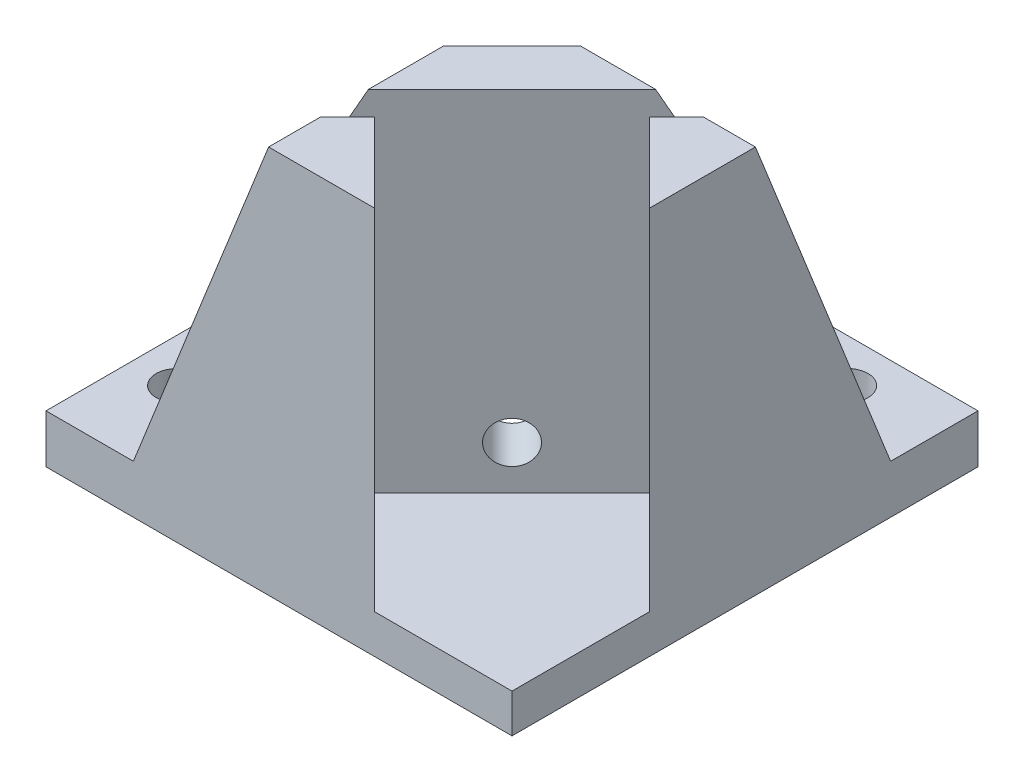
ISO-10303-21;
HEADER;
FILE_DESCRIPTION(('STEP AP214'),'2;1');
FILE_NAME('part.step','',(''),(''),'','','');
FILE_SCHEMA(('AUTOMOTIVE_DESIGN { 1 0 10303 214 1 1 1 1 }'));
ENDSEC;
DATA;
#1=APPLICATION_CONTEXT('core data for automotive mechanical design processes');
#2=APPLICATION_PROTOCOL_DEFINITION('international standard','automotive_design',2000,#1);
#3=PRODUCT_CONTEXT('',#1,'mechanical');
#4=PRODUCT('Part','Part','',(#3));
#5=PRODUCT_RELATED_PRODUCT_CATEGORY('part','',(#4));
#6=PRODUCT_DEFINITION_FORMATION('','',#4);
#7=PRODUCT_DEFINITION_CONTEXT('part definition',#1,'design');
#8=PRODUCT_DEFINITION('design','',#6,#7);
#9=PRODUCT_DEFINITION_SHAPE('','',#8);
#10=(LENGTH_UNIT() NAMED_UNIT(*) SI_UNIT(.MILLI.,.METRE.));
#11=(NAMED_UNIT(*) PLANE_ANGLE_UNIT() SI_UNIT($,.RADIAN.));
#12=(NAMED_UNIT(*) SI_UNIT($,.STERADIAN.) SOLID_ANGLE_UNIT());
#13=UNCERTAINTY_MEASURE_WITH_UNIT(LENGTH_MEASURE(1.E-05),#10,'distance_accuracy_value','');
#14=(GEOMETRIC_REPRESENTATION_CONTEXT(3) GLOBAL_UNCERTAINTY_ASSIGNED_CONTEXT((#13)) GLOBAL_UNIT_ASSIGNED_CONTEXT((#10,
#11,#12)) REPRESENTATION_CONTEXT('',''));
#15=CARTESIAN_POINT('',(0.,0.,0.));
#16=DIRECTION('',(0.,0.,1.));
#17=DIRECTION('',(1.,0.,0.));
#18=AXIS2_PLACEMENT_3D('',#15,#16,#17);
#19=CARTESIAN_POINT('',(0.,40.,0.));
#20=DIRECTION('',(0.,1.,0.));
#21=DIRECTION('',(0.,0.,1.));
#22=AXIS2_PLACEMENT_3D('',#19,#20,#21);
#23=PLANE('',#22);
#24=DIRECTION('',(1.,0.,0.));
#25=VECTOR('',#24,1.);
#26=CARTESIAN_POINT('',(0.,40.,-25.0709011047266));
#27=LINE('',#26,#25);
#28=CARTESIAN_POINT('',(30.,40.,-25.0709011047266));
#29=VERTEX_POINT('',#28);
#30=CARTESIAN_POINT('',(37.7155620453992,40.,-25.0709011047266));
#31=VERTEX_POINT('',#30);
#32=EDGE_CURVE('E11',#29,#31,#27,.T.);
#33=ORIENTED_EDGE('',*,*,#32,.F.);
#34=DIRECTION('',(-0.707106781186549,0.,0.707106781186546));
#35=VECTOR('',#34,1.);
#36=CARTESIAN_POINT('',(30.,40.,-25.0709011047266));
#37=LINE('',#36,#35);
#38=CARTESIAN_POINT('',(22.9290988952734,40.,-18.));
#39=VERTEX_POINT('',#38);
#40=EDGE_CURVE('E311',#29,#39,#37,.T.);
#41=ORIENTED_EDGE('',*,*,#40,.T.);
#42=DIRECTION('',(0.,0.,-1.));
#43=VECTOR('',#42,1.);
#44=CARTESIAN_POINT('',(22.9290988952734,40.,12.));
#45=LINE('',#44,#43);
#46=CARTESIAN_POINT('',(22.9290988952734,40.,-10.2844379546007));
#47=VERTEX_POINT('',#46);
#48=EDGE_CURVE('E292',#47,#39,#45,.T.);
#49=ORIENTED_EDGE('',*,*,#48,.F.);
#50=DIRECTION('',(-0.707106781186547,0.,0.707106781186549));
#51=VECTOR('',#50,1.);
#52=CARTESIAN_POINT('',(23.2512626584708,40.,-10.6066017177981));
#53=LINE('',#52,#51);
#54=EDGE_CURVE('E358',#31,#47,#53,.T.);
#55=ORIENTED_EDGE('',*,*,#54,.F.);
#56=EDGE_LOOP('',(#33,#41,#49,#55));
#57=FACE_BOUND('',#56,.T.);
#58=ADVANCED_FACE('F39',(#57),#23,.T.);
#59=CARTESIAN_POINT('',(22.9290988952734,40.,0.));
#60=VERTEX_POINT('',#59);
#61=CARTESIAN_POINT('',(22.9290988952734,40.,-5.33469048629493));
#62=VERTEX_POINT('',#61);
#63=EDGE_CURVE('E295',#60,#62,#45,.T.);
#64=ORIENTED_EDGE('',*,*,#63,.F.);
#65=DIRECTION('',(1.,0.,0.));
#66=VECTOR('',#65,1.);
#67=CARTESIAN_POINT('',(0.,40.,0.));
#68=LINE('',#67,#66);
#69=CARTESIAN_POINT('',(33.857864376269,40.,0.));
#70=VERTEX_POINT('',#69);
#71=EDGE_CURVE('E254',#60,#70,#68,.T.);
#72=ORIENTED_EDGE('',*,*,#71,.T.);
#73=DIRECTION('',(0.707106781186546,0.,0.707106781186549));
#74=VECTOR('',#73,1.);
#75=CARTESIAN_POINT('',(33.857864376269,40.,0.));
#76=LINE('',#75,#74);
#77=CARTESIAN_POINT('',(25.7261363926238,40.,-8.13172798364525));
#78=VERTEX_POINT('',#77);
#79=EDGE_CURVE('E351',#78,#70,#76,.T.);
#80=ORIENTED_EDGE('',*,*,#79,.F.);
#81=DIRECTION('',(0.707106781186549,0.,-0.707106781186546));
#82=VECTOR('',#81,1.);
#83=CARTESIAN_POINT('',(17.9479617995718,40.,-0.353553390593284));
#84=LINE('',#83,#82);
#85=EDGE_CURVE('E360',#62,#78,#84,.T.);
#86=ORIENTED_EDGE('',*,*,#85,.F.);
#87=EDGE_LOOP('',(#64,#72,#80,#86));
#88=FACE_BOUND('',#87,.T.);
#89=ADVANCED_FACE('F423',(#88),#23,.T.);
#90=CARTESIAN_POINT('',(30.,40.,-48.));
#91=DIRECTION('',(1.,0.,0.));
#92=DIRECTION('',(0.,0.,-1.));
#93=AXIS2_PLACEMENT_3D('',#90,#91,#92);
#94=PLANE('',#93);
#95=DIRECTION('',(0.,-1.,0.));
#96=VECTOR('',#95,1.);
#97=CARTESIAN_POINT('',(30.,40.,-25.0709011047266));
#98=LINE('',#97,#96);
#99=CARTESIAN_POINT('',(30.,0.,-25.0709011047266));
#100=VERTEX_POINT('',#99);
#101=EDGE_CURVE('E316',#29,#100,#98,.T.);
#102=ORIENTED_EDGE('',*,*,#101,.F.);
#103=DIRECTION('',(0.,0.929124297161704,0.369767549176195));
#104=VECTOR('',#103,1.);
#105=CARTESIAN_POINT('',(30.,40.,-25.0709011047266));
#106=LINE('',#105,#104);
#107=CARTESIAN_POINT('',(30.,5.,-39.));
#108=VERTEX_POINT('',#107);
#109=EDGE_CURVE('E199',#108,#29,#106,.T.);
#110=ORIENTED_EDGE('',*,*,#109,.F.);
#111=DIRECTION('',(0.,0.,1.));
#112=VECTOR('',#111,1.);
#113=CARTESIAN_POINT('',(30.,5.,-39.));
#114=LINE('',#113,#112);
#115=CARTESIAN_POINT('',(30.,5.,-48.));
#116=VERTEX_POINT('',#115);
#117=EDGE_CURVE('E191',#116,#108,#114,.T.);
#118=ORIENTED_EDGE('',*,*,#117,.F.);
#119=DIRECTION('',(0.,-1.,0.));
#120=VECTOR('',#119,1.);
#121=CARTESIAN_POINT('',(30.,40.,-48.));
#122=LINE('',#121,#120);
#123=CARTESIAN_POINT('',(30.,0.,-48.));
#124=VERTEX_POINT('',#123);
#125=EDGE_CURVE('E204',#116,#124,#122,.T.);
#126=ORIENTED_EDGE('',*,*,#125,.T.);
#127=DIRECTION('',(0.,0.,1.));
#128=VECTOR('',#127,1.);
#129=CARTESIAN_POINT('',(30.,0.,-48.));
#130=LINE('',#129,#128);
#131=EDGE_CURVE('E271',#124,#100,#130,.T.);
#132=ORIENTED_EDGE('',*,*,#131,.T.);
#133=EDGE_LOOP('',(#102,#110,#118,#126,#132));
#134=FACE_BOUND('',#133,.T.);
#135=ADVANCED_FACE('F203',(#134),#94,.F.);
#136=CARTESIAN_POINT('',(30.,40.,-18.));
#137=DIRECTION('',(0.,0.,1.));
#138=DIRECTION('',(1.,0.,0.));
#139=AXIS2_PLACEMENT_3D('',#136,#137,#138);
#140=PLANE('',#139);
#141=DIRECTION('',(0.,-1.,0.));
#142=VECTOR('',#141,1.);
#143=CARTESIAN_POINT('',(0.,40.,-18.));
#144=LINE('',#143,#142);
#145=CARTESIAN_POINT('',(0.,5.,-18.));
#146=VERTEX_POINT('',#145);
#147=CARTESIAN_POINT('',(0.,0.,-18.));
#148=VERTEX_POINT('',#147);
#149=EDGE_CURVE('E213',#146,#148,#144,.T.);
#150=ORIENTED_EDGE('',*,*,#149,.F.);
#151=DIRECTION('',(-1.,0.,0.));
#152=VECTOR('',#151,1.);
#153=CARTESIAN_POINT('',(9.,5.,-18.));
#154=LINE('',#153,#152);
#155=CARTESIAN_POINT('',(9.,5.,-18.));
#156=VERTEX_POINT('',#155);
#157=EDGE_CURVE('E298',#156,#146,#154,.T.);
#158=ORIENTED_EDGE('',*,*,#157,.F.);
#159=DIRECTION('',(-0.369767549176194,-0.929124297161704,0.));
#160=VECTOR('',#159,1.);
#161=CARTESIAN_POINT('',(22.9290988952734,40.,-18.));
#162=LINE('',#161,#160);
#163=EDGE_CURVE('E293',#39,#156,#162,.T.);
#164=ORIENTED_EDGE('',*,*,#163,.F.);
#165=DIRECTION('',(0.,-1.,0.));
#166=VECTOR('',#165,1.);
#167=CARTESIAN_POINT('',(22.9290988952734,40.,-18.));
#168=LINE('',#167,#166);
#169=CARTESIAN_POINT('',(22.9290988952734,0.,-18.));
#170=VERTEX_POINT('',#169);
#171=EDGE_CURVE('E281',#39,#170,#168,.T.);
#172=ORIENTED_EDGE('',*,*,#171,.T.);
#173=DIRECTION('',(-1.,0.,0.));
#174=VECTOR('',#173,1.);
#175=CARTESIAN_POINT('',(30.,0.,-18.));
#176=LINE('',#175,#174);
#177=EDGE_CURVE('E256',#170,#148,#176,.T.);
#178=ORIENTED_EDGE('',*,*,#177,.T.);
#179=EDGE_LOOP('',(#150,#158,#164,#172,#178));
#180=FACE_BOUND('',#179,.T.);
#181=ADVANCED_FACE('F277',(#180),#140,.F.);
#182=CARTESIAN_POINT('',(0.,4.,0.));
#183=DIRECTION('',(0.,1.,0.));
#184=DIRECTION('',(0.,0.,1.));
#185=AXIS2_PLACEMENT_3D('',#182,#183,#184);
#186=PLANE('',#185);
#187=DIRECTION('',(-0.707106781186558,0.,-0.707106781186537));
#188=VECTOR('',#187,1.);
#189=CARTESIAN_POINT('',(48.,4.,-14.1421356237309));
#190=LINE('',#189,#188);
#191=CARTESIAN_POINT('',(48.,4.,-14.1421356237309));
#192=VERTEX_POINT('',#191);
#193=CARTESIAN_POINT('',(37.3933982822019,4.,-24.7487373415292));
#194=VERTEX_POINT('',#193);
#195=EDGE_CURVE('E350',#192,#194,#190,.T.);
#196=ORIENTED_EDGE('',*,*,#195,.T.);
#197=DIRECTION('',(-0.70710678118655,0.,0.707106781186545));
#198=VECTOR('',#197,1.);
#199=CARTESIAN_POINT('',(37.3933982822018,4.,-24.7487373415291));
#200=LINE('',#199,#198);
#201=CARTESIAN_POINT('',(23.2512626584709,4.,-10.6066017177981));
#202=VERTEX_POINT('',#201);
#203=EDGE_CURVE('E353',#194,#202,#200,.T.);
#204=ORIENTED_EDGE('',*,*,#203,.T.);
#205=DIRECTION('',(0.707106781186558,0.,0.707106781186537));
#206=VECTOR('',#205,1.);
#207=CARTESIAN_POINT('',(33.857864376269,4.,0.));
#208=LINE('',#207,#206);
#209=CARTESIAN_POINT('',(33.857864376269,4.,0.));
#210=VERTEX_POINT('',#209);
#211=EDGE_CURVE('E347',#202,#210,#208,.T.);
#212=ORIENTED_EDGE('',*,*,#211,.T.);
#213=DIRECTION('',(1.,0.,0.));
#214=VECTOR('',#213,1.);
#215=CARTESIAN_POINT('',(0.,4.,0.));
#216=LINE('',#215,#214);
#217=CARTESIAN_POINT('',(48.,4.,0.));
#218=VERTEX_POINT('',#217);
#219=EDGE_CURVE('E264',#210,#218,#216,.T.);
#220=ORIENTED_EDGE('',*,*,#219,.T.);
#221=DIRECTION('',(0.,0.,-1.));
#222=VECTOR('',#221,1.);
#223=CARTESIAN_POINT('',(48.,4.,0.));
#224=LINE('',#223,#222);
#225=EDGE_CURVE('E227',#218,#192,#224,.T.);
#226=ORIENTED_EDGE('',*,*,#225,.T.);
#227=EDGE_LOOP('',(#196,#204,#212,#220,#226));
#228=FACE_BOUND('',#227,.T.);
#229=ADVANCED_FACE('F387',(#228),#186,.T.);
#230=CARTESIAN_POINT('',(23.2512626584708,4.,-10.6066017177981));
#231=DIRECTION('',(-0.707106781186548,0.,-0.707106781186547));
#232=DIRECTION('',(-0.707106781186547,0.,0.707106781186548));
#233=AXIS2_PLACEMENT_3D('',#230,#231,#232);
#234=PLANE('',#233);
#235=CARTESIAN_POINT('',(30.3223304703364,8.5,-17.6776695296636));
#236=DIRECTION('',(0.707106781186548,0.,0.707106781186547));
#237=DIRECTION('',(0.707106781186547,0.,-0.707106781186548));
#238=AXIS2_PLACEMENT_3D('',#235,#236,#237);
#239=CIRCLE('',#238,2.15);
#240=CARTESIAN_POINT('',(31.8426100498874,8.5,-19.1979491092147));
#241=VERTEX_POINT('',#240);
#242=EDGE_CURVE('E234',#241,#241,#239,.T.);
#243=ORIENTED_EDGE('',*,*,#242,.F.);
#244=EDGE_LOOP('',(#243));
#245=FACE_BOUND('',#244,.T.);
#246=DIRECTION('',(0.,1.,0.));
#247=VECTOR('',#246,1.);
#248=CARTESIAN_POINT('',(45.1715728752539,4.,-32.5269119345811));
#249=LINE('',#248,#247);
#250=CARTESIAN_POINT('',(45.1715728752539,12.5,-32.5269119345811));
#251=VERTEX_POINT('',#250);
#252=CARTESIAN_POINT('',(45.1715728752539,21.2650925227144,-32.5269119345811));
#253=VERTEX_POINT('',#252);
#254=EDGE_CURVE('E374',#251,#253,#249,.T.);
#255=ORIENTED_EDGE('',*,*,#254,.T.);
#256=DIRECTION('',(-0.346817104595912,0.871456133101039,0.346817104595913));
#257=VECTOR('',#256,1.);
#258=CARTESIAN_POINT('',(45.1164614610626,21.4035723706351,-32.4718005203899));
#259=LINE('',#258,#257);
#260=EDGE_CURVE('E399',#253,#31,#259,.T.);
#261=ORIENTED_EDGE('',*,*,#260,.T.);
#262=ORIENTED_EDGE('',*,*,#54,.T.);
#263=DIRECTION('',(-0.346817104595912,-0.871456133101039,0.346817104595913));
#264=VECTOR('',#263,1.);
#265=CARTESIAN_POINT('',(12.126107822719,12.8550503961381,0.518553117953728));
#266=LINE('',#265,#264);
#267=CARTESIAN_POINT('',(15.4730880654188,21.2650925227143,-2.82842712474613));
#268=VERTEX_POINT('',#267);
#269=EDGE_CURVE('E303',#47,#268,#266,.T.);
#270=ORIENTED_EDGE('',*,*,#269,.T.);
#271=DIRECTION('',(0.,1.,0.));
#272=VECTOR('',#271,1.);
#273=CARTESIAN_POINT('',(15.4730880654188,4.,-2.82842712474613));
#274=LINE('',#273,#272);
#275=CARTESIAN_POINT('',(15.4730880654188,12.5,-2.82842712474613));
#276=VERTEX_POINT('',#275);
#277=EDGE_CURVE('E371',#276,#268,#274,.T.);
#278=ORIENTED_EDGE('',*,*,#277,.F.);
#279=DIRECTION('',(-0.707106781186551,0.,0.707106781186544));
#280=VECTOR('',#279,1.);
#281=CARTESIAN_POINT('',(23.2512626584709,12.5,-10.6066017177981));
#282=LINE('',#281,#280);
#283=CARTESIAN_POINT('',(23.2512626584708,12.5,-10.6066017177981));
#284=VERTEX_POINT('',#283);
#285=EDGE_CURVE('E324',#284,#276,#282,.T.);
#286=ORIENTED_EDGE('',*,*,#285,.F.);
#287=DIRECTION('',(0.,-1.,0.));
#288=VECTOR('',#287,1.);
#289=CARTESIAN_POINT('',(23.2512626584709,12.5,-10.6066017177981));
#290=LINE('',#289,#288);
#291=EDGE_CURVE('E319',#284,#202,#290,.T.);
#292=ORIENTED_EDGE('',*,*,#291,.T.);
#293=ORIENTED_EDGE('',*,*,#203,.F.);
#294=DIRECTION('',(0.,-1.,0.));
#295=VECTOR('',#294,1.);
#296=CARTESIAN_POINT('',(37.3933982822019,12.5,-24.7487373415291));
#297=LINE('',#296,#295);
#298=CARTESIAN_POINT('',(37.3933982822019,12.5,-24.7487373415292));
#299=VERTEX_POINT('',#298);
#300=EDGE_CURVE('E333',#299,#194,#297,.T.);
#301=ORIENTED_EDGE('',*,*,#300,.F.);
#302=DIRECTION('',(-0.707106781186548,0.,0.707106781186547));
#303=VECTOR('',#302,1.);
#304=CARTESIAN_POINT('',(37.3933982822019,12.5,-24.7487373415291));
#305=LINE('',#304,#303);
#306=EDGE_CURVE('E327',#251,#299,#305,.T.);
#307=ORIENTED_EDGE('',*,*,#306,.F.);
#308=EDGE_LOOP('',(#255,#261,#262,#270,#278,#286,#292,#293,#301,#307));
#309=FACE_BOUND('',#308,.T.);
#310=ADVANCED_FACE('F402',(#245,#309),#234,.F.);
#311=CARTESIAN_POINT('',(45.1715728752539,4.,-32.5269119345811));
#312=DIRECTION('',(0.707106781186557,0.,-0.707106781186538));
#313=DIRECTION('',(-0.707106781186538,0.,-0.707106781186557));
#314=AXIS2_PLACEMENT_3D('',#311,#312,#313);
#315=PLANE('',#314);
#316=DIRECTION('',(0.,1.,0.));
#317=VECTOR('',#316,1.);
#318=CARTESIAN_POINT('',(47.6464466094067,4.,-30.0520382004282));
#319=LINE('',#318,#317);
#320=CARTESIAN_POINT('',(47.6464466094067,12.5,-30.0520382004282));
#321=VERTEX_POINT('',#320);
#322=CARTESIAN_POINT('',(47.6464466094067,27.4837705109039,-30.0520382004282));
#323=VERTEX_POINT('',#322);
#324=EDGE_CURVE('E377',#321,#323,#319,.T.);
#325=ORIENTED_EDGE('',*,*,#324,.T.);
#326=DIRECTION('',(-0.346817104595905,-0.871456133101042,-0.346817104595914));
#327=VECTOR('',#326,1.);
#328=CARTESIAN_POINT('',(39.953442221264,8.15336331016473,-37.7450425885711));
#329=LINE('',#328,#327);
#330=EDGE_CURVE('E405',#323,#253,#329,.T.);
#331=ORIENTED_EDGE('',*,*,#330,.T.);
#332=ORIENTED_EDGE('',*,*,#254,.F.);
#333=DIRECTION('',(-0.707106781186538,0.,-0.707106781186557));
#334=VECTOR('',#333,1.);
#335=CARTESIAN_POINT('',(45.1715728752539,12.5,-32.5269119345811));
#336=LINE('',#335,#334);
#337=EDGE_CURVE('E323',#321,#251,#336,.T.);
#338=ORIENTED_EDGE('',*,*,#337,.F.);
#339=EDGE_LOOP('',(#325,#331,#332,#338));
#340=FACE_BOUND('',#339,.T.);
#341=ADVANCED_FACE('F481',(#340),#315,.F.);
#342=CARTESIAN_POINT('',(47.6464466094067,4.,-30.0520382004282));
#343=DIRECTION('',(0.707106781186547,0.,0.707106781186548));
#344=DIRECTION('',(0.707106781186548,0.,-0.707106781186547));
#345=AXIS2_PLACEMENT_3D('',#342,#343,#344);
#346=PLANE('',#345);
#347=DIRECTION('',(0.707106781186548,0.,-0.707106781186547));
#348=VECTOR('',#347,1.);
#349=CARTESIAN_POINT('',(47.6464466094067,40.,-30.0520382004282));
#350=LINE('',#349,#348);
#351=CARTESIAN_POINT('',(39.8682720163547,40.,-22.2738636073762));
#352=VERTEX_POINT('',#351);
#353=CARTESIAN_POINT('',(42.6653095137051,40.,-25.0709011047266));
#354=VERTEX_POINT('',#353);
#355=EDGE_CURVE('E336',#352,#354,#350,.T.);
#356=ORIENTED_EDGE('',*,*,#355,.T.);
#357=DIRECTION('',(0.346817104595913,-0.871456133101039,-0.346817104595913));
#358=VECTOR('',#357,1.);
#359=CARTESIAN_POINT('',(54.7440849575937,9.6493546557018,-37.1496765486151));
#360=LINE('',#359,#358);
#361=EDGE_CURVE('E54',#354,#323,#360,.T.);
#362=ORIENTED_EDGE('',*,*,#361,.T.);
#363=ORIENTED_EDGE('',*,*,#324,.F.);
#364=DIRECTION('',(0.707106781186548,0.,-0.707106781186547));
#365=VECTOR('',#364,1.);
#366=CARTESIAN_POINT('',(47.6464466094067,12.5,-30.0520382004282));
#367=LINE('',#366,#365);
#368=CARTESIAN_POINT('',(39.8682720163547,12.5,-22.2738636073762));
#369=VERTEX_POINT('',#368);
#370=EDGE_CURVE('E320',#369,#321,#367,.T.);
#371=ORIENTED_EDGE('',*,*,#370,.F.);
#372=DIRECTION('',(0.,1.,0.));
#373=VECTOR('',#372,1.);
#374=CARTESIAN_POINT('',(39.8682720163547,4.,-22.2738636073762));
#375=LINE('',#374,#373);
#376=EDGE_CURVE('E356',#369,#352,#375,.T.);
#377=ORIENTED_EDGE('',*,*,#376,.T.);
#378=EDGE_LOOP('',(#356,#362,#363,#371,#377));
#379=FACE_BOUND('',#378,.T.);
#380=ADVANCED_FACE('F476',(#379),#346,.F.);
#381=CARTESIAN_POINT('',(0.,40.,-18.));
#382=DIRECTION('',(1.,0.,0.));
#383=DIRECTION('',(0.,0.,-1.));
#384=AXIS2_PLACEMENT_3D('',#381,#382,#383);
#385=PLANE('',#384);
#386=DIRECTION('',(0.,-1.,0.));
#387=VECTOR('',#386,1.);
#388=CARTESIAN_POINT('',(0.,40.,0.));
#389=LINE('',#388,#387);
#390=CARTESIAN_POINT('',(0.,5.,0.));
#391=VERTEX_POINT('',#390);
#392=CARTESIAN_POINT('',(0.,0.,0.));
#393=VERTEX_POINT('',#392);
#394=EDGE_CURVE('E222',#391,#393,#389,.T.);
#395=ORIENTED_EDGE('',*,*,#394,.F.);
#396=DIRECTION('',(0.,0.,-1.));
#397=VECTOR('',#396,1.);
#398=CARTESIAN_POINT('',(0.,5.,12.));
#399=LINE('',#398,#397);
#400=EDGE_CURVE('E290',#391,#146,#399,.T.);
#401=ORIENTED_EDGE('',*,*,#400,.T.);
#402=ORIENTED_EDGE('',*,*,#149,.T.);
#403=DIRECTION('',(0.,0.,1.));
#404=VECTOR('',#403,1.);
#405=CARTESIAN_POINT('',(0.,0.,-18.));
#406=LINE('',#405,#404);
#407=EDGE_CURVE('E260',#148,#393,#406,.T.);
#408=ORIENTED_EDGE('',*,*,#407,.T.);
#409=EDGE_LOOP('',(#395,#401,#402,#408));
#410=FACE_BOUND('',#409,.T.);
#411=ADVANCED_FACE('F41',(#410),#385,.F.);
#412=CARTESIAN_POINT('',(0.,40.,0.));
#413=DIRECTION('',(0.,0.,-1.));
#414=DIRECTION('',(-1.,0.,0.));
#415=AXIS2_PLACEMENT_3D('',#412,#413,#414);
#416=PLANE('',#415);
#417=DIRECTION('',(-0.369767549176194,-0.929124297161704,0.));
#418=VECTOR('',#417,1.);
#419=CARTESIAN_POINT('',(19.7940481346399,32.1224784569942,0.));
#420=LINE('',#419,#418);
#421=CARTESIAN_POINT('',(9.,5.,0.));
#422=VERTEX_POINT('',#421);
#423=EDGE_CURVE('E307',#60,#422,#420,.T.);
#424=ORIENTED_EDGE('',*,*,#423,.T.);
#425=DIRECTION('',(-1.,0.,0.));
#426=VECTOR('',#425,1.);
#427=CARTESIAN_POINT('',(0.,5.,0.));
#428=LINE('',#427,#426);
#429=EDGE_CURVE('E235',#422,#391,#428,.T.);
#430=ORIENTED_EDGE('',*,*,#429,.T.);
#431=ORIENTED_EDGE('',*,*,#394,.T.);
#432=DIRECTION('',(1.,0.,0.));
#433=VECTOR('',#432,1.);
#434=CARTESIAN_POINT('',(0.,0.,0.));
#435=LINE('',#434,#433);
#436=CARTESIAN_POINT('',(48.,0.,0.));
#437=VERTEX_POINT('',#436);
#438=EDGE_CURVE('E263',#393,#437,#435,.T.);
#439=ORIENTED_EDGE('',*,*,#438,.T.);
#440=DIRECTION('',(0.,-1.,0.));
#441=VECTOR('',#440,1.);
#442=CARTESIAN_POINT('',(48.,40.,0.));
#443=LINE('',#442,#441);
#444=EDGE_CURVE('E215',#218,#437,#443,.T.);
#445=ORIENTED_EDGE('',*,*,#444,.F.);
#446=ORIENTED_EDGE('',*,*,#219,.F.);
#447=DIRECTION('',(0.,1.,0.));
#448=VECTOR('',#447,1.);
#449=CARTESIAN_POINT('',(33.857864376269,40.,0.));
#450=LINE('',#449,#448);
#451=EDGE_CURVE('E382',#210,#70,#450,.T.);
#452=ORIENTED_EDGE('',*,*,#451,.T.);
#453=ORIENTED_EDGE('',*,*,#71,.F.);
#454=EDGE_LOOP('',(#424,#430,#431,#439,#445,#446,#452,#453));
#455=FACE_BOUND('',#454,.T.);
#456=ADVANCED_FACE('F390',(#455),#416,.F.);
#457=CARTESIAN_POINT('',(48.,40.,0.));
#458=DIRECTION('',(-1.,0.,0.));
#459=DIRECTION('',(0.,0.,1.));
#460=AXIS2_PLACEMENT_3D('',#457,#458,#459);
#461=PLANE('',#460);
#462=DIRECTION('',(0.,0.,1.));
#463=VECTOR('',#462,1.);
#464=CARTESIAN_POINT('',(48.,5.,0.));
#465=LINE('',#464,#463);
#466=CARTESIAN_POINT('',(48.,5.,-48.));
#467=VERTEX_POINT('',#466);
#468=CARTESIAN_POINT('',(48.,5.,-39.));
#469=VERTEX_POINT('',#468);
#470=EDGE_CURVE('E194',#467,#469,#465,.T.);
#471=ORIENTED_EDGE('',*,*,#470,.T.);
#472=DIRECTION('',(0.,0.929124297161704,0.369767549176195));
#473=VECTOR('',#472,1.);
#474=CARTESIAN_POINT('',(48.,48.613359140588,-21.6430059250192));
#475=LINE('',#474,#473);
#476=CARTESIAN_POINT('',(48.,40.,-25.0709011047266));
#477=VERTEX_POINT('',#476);
#478=EDGE_CURVE('E242',#469,#477,#475,.T.);
#479=ORIENTED_EDGE('',*,*,#478,.T.);
#480=DIRECTION('',(0.,0.,-1.));
#481=VECTOR('',#480,1.);
#482=CARTESIAN_POINT('',(48.,40.,0.));
#483=LINE('',#482,#481);
#484=CARTESIAN_POINT('',(48.,40.,-14.1421356237309));
#485=VERTEX_POINT('',#484);
#486=EDGE_CURVE('E217',#485,#477,#483,.T.);
#487=ORIENTED_EDGE('',*,*,#486,.F.);
#488=DIRECTION('',(0.,-1.,0.));
#489=VECTOR('',#488,1.);
#490=CARTESIAN_POINT('',(48.,40.,-14.1421356237309));
#491=LINE('',#490,#489);
#492=EDGE_CURVE('E367',#485,#192,#491,.T.);
#493=ORIENTED_EDGE('',*,*,#492,.T.);
#494=ORIENTED_EDGE('',*,*,#225,.F.);
#495=ORIENTED_EDGE('',*,*,#444,.T.);
#496=DIRECTION('',(0.,0.,-1.));
#497=VECTOR('',#496,1.);
#498=CARTESIAN_POINT('',(48.,0.,0.));
#499=LINE('',#498,#497);
#500=CARTESIAN_POINT('',(48.,0.,-48.));
#501=VERTEX_POINT('',#500);
#502=EDGE_CURVE('E267',#437,#501,#499,.T.);
#503=ORIENTED_EDGE('',*,*,#502,.T.);
#504=DIRECTION('',(0.,-1.,0.));
#505=VECTOR('',#504,1.);
#506=CARTESIAN_POINT('',(48.,40.,-48.));
#507=LINE('',#506,#505);
#508=EDGE_CURVE('E212',#467,#501,#507,.T.);
#509=ORIENTED_EDGE('',*,*,#508,.F.);
#510=EDGE_LOOP('',(#471,#479,#487,#493,#494,#495,#503,#509));
#511=FACE_BOUND('',#510,.T.);
#512=ADVANCED_FACE('F249',(#511),#461,.F.);
#513=CARTESIAN_POINT('',(48.,40.,-48.));
#514=DIRECTION('',(0.,0.,1.));
#515=DIRECTION('',(1.,0.,0.));
#516=AXIS2_PLACEMENT_3D('',#513,#514,#515);
#517=PLANE('',#516);
#518=ORIENTED_EDGE('',*,*,#125,.F.);
#519=DIRECTION('',(-1.,0.,0.));
#520=VECTOR('',#519,1.);
#521=CARTESIAN_POINT('',(60.,5.,-48.));
#522=LINE('',#521,#520);
#523=EDGE_CURVE('E187',#467,#116,#522,.T.);
#524=ORIENTED_EDGE('',*,*,#523,.F.);
#525=ORIENTED_EDGE('',*,*,#508,.T.);
#526=DIRECTION('',(-1.,0.,0.));
#527=VECTOR('',#526,1.);
#528=CARTESIAN_POINT('',(48.,0.,-48.));
#529=LINE('',#528,#527);
#530=EDGE_CURVE('E210',#501,#124,#529,.T.);
#531=ORIENTED_EDGE('',*,*,#530,.T.);
#532=EDGE_LOOP('',(#518,#524,#525,#531));
#533=FACE_BOUND('',#532,.T.);
#534=ADVANCED_FACE('F208',(#533),#517,.F.);
#535=EDGE_CURVE('E43',#354,#477,#27,.T.);
#536=ORIENTED_EDGE('',*,*,#535,.F.);
#537=ORIENTED_EDGE('',*,*,#355,.F.);
#538=DIRECTION('',(-0.707106781186548,0.,-0.707106781186547));
#539=VECTOR('',#538,1.);
#540=CARTESIAN_POINT('',(31.0710678118654,40.,-31.0710678118654));
#541=LINE('',#540,#539);
#542=EDGE_CURVE('E224',#485,#352,#541,.T.);
#543=ORIENTED_EDGE('',*,*,#542,.F.);
#544=ORIENTED_EDGE('',*,*,#486,.T.);
#545=EDGE_LOOP('',(#536,#537,#543,#544));
#546=FACE_BOUND('',#545,.T.);
#547=ADVANCED_FACE('F253',(#546),#23,.T.);
#548=CARTESIAN_POINT('',(0.,0.,0.));
#549=DIRECTION('',(0.,1.,0.));
#550=DIRECTION('',(0.,0.,1.));
#551=AXIS2_PLACEMENT_3D('',#548,#549,#550);
#552=PLANE('',#551);
#553=CARTESIAN_POINT('',(4.5,0.,-9.));
#554=DIRECTION('',(0.,1.,0.));
#555=DIRECTION('',(0.,0.,1.));
#556=AXIS2_PLACEMENT_3D('',#553,#554,#555);
#557=CIRCLE('',#556,2.15);
#558=CARTESIAN_POINT('',(4.5,0.,-6.85));
#559=VERTEX_POINT('',#558);
#560=EDGE_CURVE('E509',#559,#559,#557,.T.);
#561=ORIENTED_EDGE('',*,*,#560,.T.);
#562=EDGE_LOOP('',(#561));
#563=FACE_BOUND('',#562,.T.);
#564=CARTESIAN_POINT('',(39.,0.,-43.5));
#565=DIRECTION('',(0.,1.,0.));
#566=DIRECTION('',(0.,0.,1.));
#567=AXIS2_PLACEMENT_3D('',#564,#565,#566);
#568=CIRCLE('',#567,2.165);
#569=CARTESIAN_POINT('',(39.,0.,-41.335));
#570=VERTEX_POINT('',#569);
#571=EDGE_CURVE('E206',#570,#570,#568,.T.);
#572=ORIENTED_EDGE('',*,*,#571,.T.);
#573=EDGE_LOOP('',(#572));
#574=FACE_BOUND('',#573,.T.);
#575=DIRECTION('',(-0.707106781186549,0.,0.707106781186546));
#576=VECTOR('',#575,1.);
#577=CARTESIAN_POINT('',(30.,0.,-25.0709011047266));
#578=LINE('',#577,#576);
#579=EDGE_CURVE('E233',#100,#170,#578,.T.);
#580=ORIENTED_EDGE('',*,*,#579,.F.);
#581=ORIENTED_EDGE('',*,*,#131,.F.);
#582=ORIENTED_EDGE('',*,*,#530,.F.);
#583=ORIENTED_EDGE('',*,*,#502,.F.);
#584=ORIENTED_EDGE('',*,*,#438,.F.);
#585=ORIENTED_EDGE('',*,*,#407,.F.);
#586=ORIENTED_EDGE('',*,*,#177,.F.);
#587=EDGE_LOOP('',(#580,#581,#582,#583,#584,#585,#586));
#588=FACE_BOUND('',#587,.T.);
#589=ADVANCED_FACE('F286',(#563,#574,#588),#552,.F.);
#590=CARTESIAN_POINT('',(33.857864376269,4.,0.));
#591=DIRECTION('',(-0.707106781186549,0.,0.707106781186546));
#592=DIRECTION('',(0.707106781186546,0.,0.707106781186549));
#593=AXIS2_PLACEMENT_3D('',#590,#591,#592);
#594=PLANE('',#593);
#595=ORIENTED_EDGE('',*,*,#211,.F.);
#596=ORIENTED_EDGE('',*,*,#291,.F.);
#597=DIRECTION('',(-0.707106781186547,0.,-0.707106781186548));
#598=VECTOR('',#597,1.);
#599=CARTESIAN_POINT('',(25.7261363926238,12.5,-8.13172798364525));
#600=LINE('',#599,#598);
#601=CARTESIAN_POINT('',(25.7261363926238,12.5,-8.13172798364525));
#602=VERTEX_POINT('',#601);
#603=EDGE_CURVE('E339',#602,#284,#600,.T.);
#604=ORIENTED_EDGE('',*,*,#603,.F.);
#605=DIRECTION('',(0.,1.,0.));
#606=VECTOR('',#605,1.);
#607=CARTESIAN_POINT('',(25.7261363926238,4.,-8.13172798364525));
#608=LINE('',#607,#606);
#609=EDGE_CURVE('E364',#602,#78,#608,.T.);
#610=ORIENTED_EDGE('',*,*,#609,.T.);
#611=ORIENTED_EDGE('',*,*,#79,.T.);
#612=ORIENTED_EDGE('',*,*,#451,.F.);
#613=EDGE_LOOP('',(#595,#596,#604,#610,#611,#612));
#614=FACE_BOUND('',#613,.T.);
#615=ADVANCED_FACE('F425',(#614),#594,.F.);
#616=CARTESIAN_POINT('',(48.,4.,-14.1421356237309));
#617=DIRECTION('',(0.707106781186547,0.,-0.707106781186548));
#618=DIRECTION('',(-0.707106781186548,0.,-0.707106781186547));
#619=AXIS2_PLACEMENT_3D('',#616,#617,#618);
#620=PLANE('',#619);
#621=ORIENTED_EDGE('',*,*,#542,.T.);
#622=ORIENTED_EDGE('',*,*,#376,.F.);
#623=DIRECTION('',(0.70710678118654,0.,0.707106781186555));
#624=VECTOR('',#623,1.);
#625=CARTESIAN_POINT('',(39.8682720163547,12.5,-22.2738636073762));
#626=LINE('',#625,#624);
#627=EDGE_CURVE('E330',#299,#369,#626,.T.);
#628=ORIENTED_EDGE('',*,*,#627,.F.);
#629=ORIENTED_EDGE('',*,*,#300,.T.);
#630=ORIENTED_EDGE('',*,*,#195,.F.);
#631=ORIENTED_EDGE('',*,*,#492,.F.);
#632=EDGE_LOOP('',(#621,#622,#628,#629,#630,#631));
#633=FACE_BOUND('',#632,.T.);
#634=ADVANCED_FACE('F490',(#633),#620,.F.);
#635=CARTESIAN_POINT('',(17.9479617995718,4.,-0.353553390593284));
#636=DIRECTION('',(0.707106781186546,0.,0.707106781186549));
#637=DIRECTION('',(0.707106781186549,0.,-0.707106781186546));
#638=AXIS2_PLACEMENT_3D('',#635,#636,#637);
#639=PLANE('',#638);
#640=DIRECTION('',(0.,1.,0.));
#641=VECTOR('',#640,1.);
#642=CARTESIAN_POINT('',(17.9479617995718,4.,-0.353553390593284));
#643=LINE('',#642,#641);
#644=CARTESIAN_POINT('',(17.9479617995718,12.5,-0.353553390593284));
#645=VERTEX_POINT('',#644);
#646=CARTESIAN_POINT('',(17.9479617995718,27.4837705109038,-0.353553390593283));
#647=VERTEX_POINT('',#646);
#648=EDGE_CURVE('E368',#645,#647,#643,.T.);
#649=ORIENTED_EDGE('',*,*,#648,.T.);
#650=DIRECTION('',(0.346817104595912,0.87145613310104,-0.346817104595911));
#651=VECTOR('',#650,1.);
#652=CARTESIAN_POINT('',(10.8503234513848,9.64935465570173,6.7440849575936));
#653=LINE('',#652,#651);
#654=EDGE_CURVE('E62',#647,#62,#653,.T.);
#655=ORIENTED_EDGE('',*,*,#654,.T.);
#656=ORIENTED_EDGE('',*,*,#85,.T.);
#657=ORIENTED_EDGE('',*,*,#609,.F.);
#658=DIRECTION('',(0.707106781186549,0.,-0.707106781186546));
#659=VECTOR('',#658,1.);
#660=CARTESIAN_POINT('',(17.9479617995718,12.5,-0.353553390593284));
#661=LINE('',#660,#659);
#662=EDGE_CURVE('E342',#645,#602,#661,.T.);
#663=ORIENTED_EDGE('',*,*,#662,.F.);
#664=EDGE_LOOP('',(#649,#655,#656,#657,#663));
#665=FACE_BOUND('',#664,.T.);
#666=ADVANCED_FACE('F418',(#665),#639,.F.);
#667=CARTESIAN_POINT('',(15.4730880654188,4.,-2.82842712474613));
#668=DIRECTION('',(-0.707106781186537,0.,0.707106781186558));
#669=DIRECTION('',(0.707106781186558,0.,0.707106781186537));
#670=AXIS2_PLACEMENT_3D('',#667,#668,#669);
#671=PLANE('',#670);
#672=ORIENTED_EDGE('',*,*,#277,.T.);
#673=DIRECTION('',(0.346817104595914,0.871456133101042,0.346817104595904));
#674=VECTOR('',#673,1.);
#675=CARTESIAN_POINT('',(10.2549574114289,8.15336331016468,-8.04655777873594));
#676=LINE('',#675,#674);
#677=EDGE_CURVE('E229',#268,#647,#676,.T.);
#678=ORIENTED_EDGE('',*,*,#677,.T.);
#679=ORIENTED_EDGE('',*,*,#648,.F.);
#680=DIRECTION('',(0.707106781186558,0.,0.707106781186537));
#681=VECTOR('',#680,1.);
#682=CARTESIAN_POINT('',(15.4730880654188,12.5,-2.82842712474613));
#683=LINE('',#682,#681);
#684=EDGE_CURVE('E344',#276,#645,#683,.T.);
#685=ORIENTED_EDGE('',*,*,#684,.F.);
#686=EDGE_LOOP('',(#672,#678,#679,#685));
#687=FACE_BOUND('',#686,.T.);
#688=ADVANCED_FACE('F430',(#687),#671,.F.);
#689=CARTESIAN_POINT('',(0.,12.5,0.));
#690=DIRECTION('',(0.,-1.,0.));
#691=DIRECTION('',(0.,0.,-1.));
#692=AXIS2_PLACEMENT_3D('',#689,#690,#691);
#693=PLANE('',#692);
#694=ORIENTED_EDGE('',*,*,#370,.T.);
#695=ORIENTED_EDGE('',*,*,#337,.T.);
#696=ORIENTED_EDGE('',*,*,#306,.T.);
#697=ORIENTED_EDGE('',*,*,#627,.T.);
#698=EDGE_LOOP('',(#694,#695,#696,#697));
#699=FACE_BOUND('',#698,.T.);
#700=ADVANCED_FACE('F436',(#699),#693,.F.);
#701=CARTESIAN_POINT('',(0.,12.5,0.));
#702=DIRECTION('',(0.,1.,0.));
#703=DIRECTION('',(0.,0.,1.));
#704=AXIS2_PLACEMENT_3D('',#701,#702,#703);
#705=PLANE('',#704);
#706=ORIENTED_EDGE('',*,*,#285,.T.);
#707=ORIENTED_EDGE('',*,*,#684,.T.);
#708=ORIENTED_EDGE('',*,*,#662,.T.);
#709=ORIENTED_EDGE('',*,*,#603,.T.);
#710=EDGE_LOOP('',(#706,#707,#708,#709));
#711=FACE_BOUND('',#710,.T.);
#712=ADVANCED_FACE('F434',(#711),#705,.T.);
#713=CARTESIAN_POINT('',(30.,40.,-25.0709011047266));
#714=DIRECTION('',(0.707106781186546,0.,0.707106781186549));
#715=DIRECTION('',(0.707106781186549,0.,-0.707106781186546));
#716=AXIS2_PLACEMENT_3D('',#713,#714,#715);
#717=PLANE('',#716);
#718=CARTESIAN_POINT('',(26.4645494476367,8.5,-21.5354505523633));
#719=DIRECTION('',(0.707106781186546,0.,0.707106781186549));
#720=DIRECTION('',(0.707106781186549,0.,-0.707106781186546));
#721=AXIS2_PLACEMENT_3D('',#718,#719,#720);
#722=CIRCLE('',#721,2.15);
#723=CARTESIAN_POINT('',(27.9848290271878,8.5,-23.0557301319144));
#724=VERTEX_POINT('',#723);
#725=EDGE_CURVE('E230',#724,#724,#722,.T.);
#726=ORIENTED_EDGE('',*,*,#725,.T.);
#727=EDGE_LOOP('',(#726));
#728=FACE_BOUND('',#727,.T.);
#729=ORIENTED_EDGE('',*,*,#579,.T.);
#730=ORIENTED_EDGE('',*,*,#171,.F.);
#731=ORIENTED_EDGE('',*,*,#40,.F.);
#732=ORIENTED_EDGE('',*,*,#101,.T.);
#733=EDGE_LOOP('',(#729,#730,#731,#732));
#734=FACE_BOUND('',#733,.T.);
#735=ADVANCED_FACE('F393',(#728,#734),#717,.F.);
#736=CARTESIAN_POINT('',(21.8370490960978,8.5,-26.1629509039022));
#737=DIRECTION('',(0.707106781186548,0.,0.707106781186547));
#738=DIRECTION('',(0.707106781186547,0.,-0.707106781186548));
#739=AXIS2_PLACEMENT_3D('',#736,#737,#738);
#740=CYLINDRICAL_SURFACE('',#739,2.15);
#741=CARTESIAN_POINT('',(31.8426100498874,8.5,-19.1979491092147));
#742=CARTESIAN_POINT('',(31.802424830901,8.5,-19.2381343282012));
#743=CARTESIAN_POINT('',(31.7622396119145,8.5,-19.2783195471876));
#744=CARTESIAN_POINT('',(31.6818691739416,8.5,-19.3586899851605));
#745=CARTESIAN_POINT('',(31.6416839549552,8.5,-19.398875204147));
#746=CARTESIAN_POINT('',(31.5613135169822,8.5,-19.4792456421199));
#747=CARTESIAN_POINT('',(31.5211282979958,8.5,-19.5194308611064));
#748=CARTESIAN_POINT('',(31.4407578600229,8.5,-19.5998012990793));
#749=CARTESIAN_POINT('',(31.4005726410364,8.5,-19.6399865180657));
#750=CARTESIAN_POINT('',(31.3202022030635,8.5,-19.7203569560386));
#751=CARTESIAN_POINT('',(31.2800169840771,8.5,-19.7605421750251));
#752=CARTESIAN_POINT('',(31.1996465461042,8.5,-19.840912612998));
#753=CARTESIAN_POINT('',(31.1594613271177,8.5,-19.8810978319844));
#754=CARTESIAN_POINT('',(31.0790908891448,8.5,-19.9614682699574));
#755=CARTESIAN_POINT('',(31.0389056701583,8.5,-20.0016534889438));
#756=CARTESIAN_POINT('',(30.9585352321854,8.5,-20.0820239269167));
#757=CARTESIAN_POINT('',(30.918350013199,8.5,-20.1222091459032));
#758=CARTESIAN_POINT('',(30.8379795752261,8.5,-20.2025795838761));
#759=CARTESIAN_POINT('',(30.7977943562396,8.5,-20.2427648028625));
#760=CARTESIAN_POINT('',(30.7174239182667,8.5,-20.3231352408354));
#761=CARTESIAN_POINT('',(30.6772386992802,8.5,-20.3633204598219));
#762=CARTESIAN_POINT('',(30.5968682613073,8.5,-20.4436908977948));
#763=CARTESIAN_POINT('',(30.5566830423209,8.5,-20.4838761167813));
#764=CARTESIAN_POINT('',(30.476312604348,8.5,-20.5642465547542));
#765=CARTESIAN_POINT('',(30.4361273853615,8.5,-20.6044317737406));
#766=CARTESIAN_POINT('',(30.3557569473886,8.5,-20.6848022117135));
#767=CARTESIAN_POINT('',(30.3155717284022,8.5,-20.7249874307));
#768=CARTESIAN_POINT('',(30.2352012904292,8.5,-20.8053578686729));
#769=CARTESIAN_POINT('',(30.1950160714428,8.5,-20.8455430876594));
#770=CARTESIAN_POINT('',(30.1146456334699,8.5,-20.9259135256323));
#771=CARTESIAN_POINT('',(30.0744604144834,8.5,-20.9660987446187));
#772=CARTESIAN_POINT('',(29.9940899765105,8.5,-21.0464691825916));
#773=CARTESIAN_POINT('',(29.9539047575241,8.5,-21.0866544015781));
#774=CARTESIAN_POINT('',(29.8735343195512,8.5,-21.167024839551));
#775=CARTESIAN_POINT('',(29.8333491005647,8.5,-21.2072100585374));
#776=CARTESIAN_POINT('',(29.7529786625918,8.5,-21.2875804965104));
#777=CARTESIAN_POINT('',(29.7127934436053,8.5,-21.3277657154968));
#778=CARTESIAN_POINT('',(29.6324230056324,8.5,-21.4081361534697));
#779=CARTESIAN_POINT('',(29.592237786646,8.5,-21.4483213724562));
#780=CARTESIAN_POINT('',(29.5118673486731,8.5,-21.5286918104291));
#781=CARTESIAN_POINT('',(29.4716821296866,8.5,-21.5688770294155));
#782=CARTESIAN_POINT('',(29.3913116917137,8.5,-21.6492474673884));
#783=CARTESIAN_POINT('',(29.3511264727272,8.5,-21.6894326863749));
#784=CARTESIAN_POINT('',(29.2707560347543,8.5,-21.7698031243478));
#785=CARTESIAN_POINT('',(29.2305708157679,8.5,-21.8099883433343));
#786=CARTESIAN_POINT('',(29.150200377795,8.5,-21.8903587813072));
#787=CARTESIAN_POINT('',(29.1100151588085,8.5,-21.9305440002936));
#788=CARTESIAN_POINT('',(29.0296447208356,8.5,-22.0109144382665));
#789=CARTESIAN_POINT('',(28.9894595018492,8.5,-22.051099657253));
#790=CARTESIAN_POINT('',(28.9090890638762,8.5,-22.1314700952259));
#791=CARTESIAN_POINT('',(28.8689038448898,8.5,-22.1716553142124));
#792=CARTESIAN_POINT('',(28.7885334069169,8.5,-22.2520257521853));
#793=CARTESIAN_POINT('',(28.7483481879304,8.5,-22.2922109711717));
#794=CARTESIAN_POINT('',(28.6679777499575,8.5,-22.3725814091446));
#795=CARTESIAN_POINT('',(28.6277925309711,8.5,-22.4127666281311));
#796=CARTESIAN_POINT('',(28.5474220929982,8.5,-22.493137066104));
#797=CARTESIAN_POINT('',(28.5072368740117,8.5,-22.5333222850904));
#798=CARTESIAN_POINT('',(28.4268664360388,8.5,-22.6136927230634));
#799=CARTESIAN_POINT('',(28.3866812170523,8.5,-22.6538779420498));
#800=CARTESIAN_POINT('',(28.3063107790794,8.5,-22.7342483800227));
#801=CARTESIAN_POINT('',(28.266125560093,8.5,-22.7744335990092));
#802=CARTESIAN_POINT('',(28.1857551221201,8.5,-22.8548040369821));
#803=CARTESIAN_POINT('',(28.1455699031336,8.5,-22.8949892559685));
#804=CARTESIAN_POINT('',(28.0651994651607,8.5,-22.9753596939414));
#805=CARTESIAN_POINT('',(28.0250142461742,8.5,-23.0155449129279));
#806=CARTESIAN_POINT('',(27.9848290271878,8.5,-23.0557301319144));
#807=B_SPLINE_CURVE_WITH_KNOTS('',3,(#741,#742,#743,#744,#745,#746,#747,#748,#749,#750,#751,
#752,#753,#754,#755,#756,#757,#758,#759,#760,#761,#762,#763,#764,#765,#766,#767,#768,#769,#770,
#771,#772,#773,#774,#775,#776,#777,#778,#779,#780,#781,#782,#783,#784,#785,#786,#787,#788,#789,
#790,#791,#792,#793,#794,#795,#796,#797,#798,#799,#800,#801,#802,#803,#804,#805,#806),
.UNSPECIFIED.,.F.,.F.,(4,2,2,2,2,2,2,2,2,2,2,2,2,2,2,2,2,2,2,2,2,2,2,2,2,2,2,2,2,2,2,2,4),(0.,
0.17049144509273,0.34098289018546,0.51147433527819,0.68196578037092,0.85245722546365,
1.02294867055638,1.19344011564911,1.36393156074184,1.53442300583457,1.7049144509273,
1.87540589602003,2.04589734111276,2.21638878620549,2.38688023129822,2.55737167639095,
2.72786312148369,2.89835456657642,3.06884601166915,3.23933745676188,3.40982890185461,
3.58032034694734,3.75081179204007,3.9213032371328,4.09179468222553,4.26228612731826,
4.43277757241099,4.60326901750372,4.77376046259645,4.94425190768918,5.11474335278191,
5.28523479787465,5.45572624296738),.UNSPECIFIED.);
#808=EDGE_CURVE('BSEAM443',#241,#724,#807,.T.);
#809=ORIENTED_EDGE('',*,*,#242,.T.);
#810=ORIENTED_EDGE('',*,*,#725,.F.);
#811=ORIENTED_EDGE('',*,*,#808,.T.);
#812=ORIENTED_EDGE('',*,*,#808,.F.);
#813=EDGE_LOOP('',(#809,#811,#810,#812));
#814=FACE_BOUND('',#813,.T.);
#815=ADVANCED_FACE('F443',(#814),#740,.F.);
#816=CARTESIAN_POINT('',(9.,5.,12.));
#817=DIRECTION('',(0.,-1.,0.));
#818=DIRECTION('',(0.,0.,-1.));
#819=AXIS2_PLACEMENT_3D('',#816,#817,#818);
#820=PLANE('',#819);
#821=CARTESIAN_POINT('',(4.5,5.,-9.));
#822=DIRECTION('',(0.,1.,0.));
#823=DIRECTION('',(0.,0.,1.));
#824=AXIS2_PLACEMENT_3D('',#821,#822,#823);
#825=CIRCLE('',#824,2.15);
#826=CARTESIAN_POINT('',(4.5,5.,-6.85));
#827=VERTEX_POINT('',#826);
#828=EDGE_CURVE('E512',#827,#827,#825,.T.);
#829=ORIENTED_EDGE('',*,*,#828,.F.);
#830=EDGE_LOOP('',(#829));
#831=FACE_BOUND('',#830,.T.);
#832=DIRECTION('',(0.,0.,-1.));
#833=VECTOR('',#832,1.);
#834=CARTESIAN_POINT('',(9.,5.,12.));
#835=LINE('',#834,#833);
#836=EDGE_CURVE('E304',#422,#156,#835,.T.);
#837=ORIENTED_EDGE('',*,*,#836,.T.);
#838=ORIENTED_EDGE('',*,*,#157,.T.);
#839=ORIENTED_EDGE('',*,*,#400,.F.);
#840=ORIENTED_EDGE('',*,*,#429,.F.);
#841=EDGE_LOOP('',(#837,#838,#839,#840));
#842=FACE_BOUND('',#841,.T.);
#843=ADVANCED_FACE('F519',(#831,#842),#820,.F.);
#844=CARTESIAN_POINT('',(22.9290988952734,40.,12.));
#845=DIRECTION('',(0.929124297161704,-0.369767549176194,0.));
#846=DIRECTION('',(0.369767549176194,0.929124297161704,0.));
#847=AXIS2_PLACEMENT_3D('',#844,#845,#846);
#848=PLANE('',#847);
#849=ORIENTED_EDGE('',*,*,#63,.T.);
#850=ORIENTED_EDGE('',*,*,#654,.F.);
#851=ORIENTED_EDGE('',*,*,#677,.F.);
#852=ORIENTED_EDGE('',*,*,#269,.F.);
#853=ORIENTED_EDGE('',*,*,#48,.T.);
#854=ORIENTED_EDGE('',*,*,#163,.T.);
#855=ORIENTED_EDGE('',*,*,#836,.F.);
#856=ORIENTED_EDGE('',*,*,#423,.F.);
#857=EDGE_LOOP('',(#849,#850,#851,#852,#853,#854,#855,#856));
#858=FACE_BOUND('',#857,.T.);
#859=ADVANCED_FACE('F413',(#858),#848,.F.);
#860=CARTESIAN_POINT('',(60.,5.,-39.));
#861=DIRECTION('',(0.,-1.,0.));
#862=DIRECTION('',(0.,0.,-1.));
#863=AXIS2_PLACEMENT_3D('',#860,#861,#862);
#864=PLANE('',#863);
#865=CARTESIAN_POINT('',(39.,5.,-43.5));
#866=DIRECTION('',(0.,1.,0.));
#867=DIRECTION('',(0.,0.,1.));
#868=AXIS2_PLACEMENT_3D('',#865,#866,#867);
#869=CIRCLE('',#868,2.165);
#870=CARTESIAN_POINT('',(39.,5.,-41.335));
#871=VERTEX_POINT('',#870);
#872=EDGE_CURVE('E506',#871,#871,#869,.T.);
#873=ORIENTED_EDGE('',*,*,#872,.F.);
#874=EDGE_LOOP('',(#873));
#875=FACE_BOUND('',#874,.T.);
#876=ORIENTED_EDGE('',*,*,#523,.T.);
#877=ORIENTED_EDGE('',*,*,#117,.T.);
#878=DIRECTION('',(-1.,0.,0.));
#879=VECTOR('',#878,1.);
#880=CARTESIAN_POINT('',(60.,5.,-39.));
#881=LINE('',#880,#879);
#882=EDGE_CURVE('E198',#469,#108,#881,.T.);
#883=ORIENTED_EDGE('',*,*,#882,.F.);
#884=ORIENTED_EDGE('',*,*,#470,.F.);
#885=EDGE_LOOP('',(#876,#877,#883,#884));
#886=FACE_BOUND('',#885,.T.);
#887=ADVANCED_FACE('F189',(#875,#886),#864,.F.);
#888=CARTESIAN_POINT('',(60.,40.,-25.0709011047266));
#889=DIRECTION('',(0.,-0.369767549176195,0.929124297161704));
#890=DIRECTION('',(0.,-0.929124297161704,-0.369767549176195));
#891=AXIS2_PLACEMENT_3D('',#888,#889,#890);
#892=PLANE('',#891);
#893=ORIENTED_EDGE('',*,*,#330,.F.);
#894=ORIENTED_EDGE('',*,*,#361,.F.);
#895=ORIENTED_EDGE('',*,*,#535,.T.);
#896=ORIENTED_EDGE('',*,*,#478,.F.);
#897=ORIENTED_EDGE('',*,*,#882,.T.);
#898=ORIENTED_EDGE('',*,*,#109,.T.);
#899=ORIENTED_EDGE('',*,*,#32,.T.);
#900=ORIENTED_EDGE('',*,*,#260,.F.);
#901=EDGE_LOOP('',(#893,#894,#895,#896,#897,#898,#899,#900));
#902=FACE_BOUND('',#901,.T.);
#903=ADVANCED_FACE('F241',(#902),#892,.F.);
#904=CARTESIAN_POINT('',(39.,-25.,-43.5));
#905=DIRECTION('',(0.,1.,0.));
#906=DIRECTION('',(0.,0.,1.));
#907=AXIS2_PLACEMENT_3D('',#904,#905,#906);
#908=CYLINDRICAL_SURFACE('',#907,2.165);
#909=ORIENTED_EDGE('',*,*,#872,.T.);
#910=EDGE_LOOP('',(#909));
#911=FACE_BOUND('',#910,.T.);
#912=ORIENTED_EDGE('',*,*,#571,.F.);
#913=EDGE_LOOP('',(#912));
#914=FACE_BOUND('',#913,.T.);
#915=ADVANCED_FACE('F534',(#911,#914),#908,.F.);
#916=CARTESIAN_POINT('',(4.5,-25.,-9.));
#917=DIRECTION('',(0.,1.,0.));
#918=DIRECTION('',(0.,0.,1.));
#919=AXIS2_PLACEMENT_3D('',#916,#917,#918);
#920=CYLINDRICAL_SURFACE('',#919,2.15);
#921=ORIENTED_EDGE('',*,*,#828,.T.);
#922=EDGE_LOOP('',(#921));
#923=FACE_BOUND('',#922,.T.);
#924=ORIENTED_EDGE('',*,*,#560,.F.);
#925=EDGE_LOOP('',(#924));
#926=FACE_BOUND('',#925,.T.);
#927=ADVANCED_FACE('F516',(#923,#926),#920,.F.);
#928=CLOSED_SHELL('',(#58,#89,#135,#181,#229,#310,#341,#380,#411,#456,#512,#534,#547,#589,#615,
#634,#666,#688,#700,#712,#735,#815,#843,#859,#887,#903,#915,#927));
#929=MANIFOLD_SOLID_BREP('B2',#928);
#930=ADVANCED_BREP_SHAPE_REPRESENTATION('',(#18,#929),#14);
#931=SHAPE_DEFINITION_REPRESENTATION(#9,#930);
ENDSEC;
END-ISO-10303-21;
